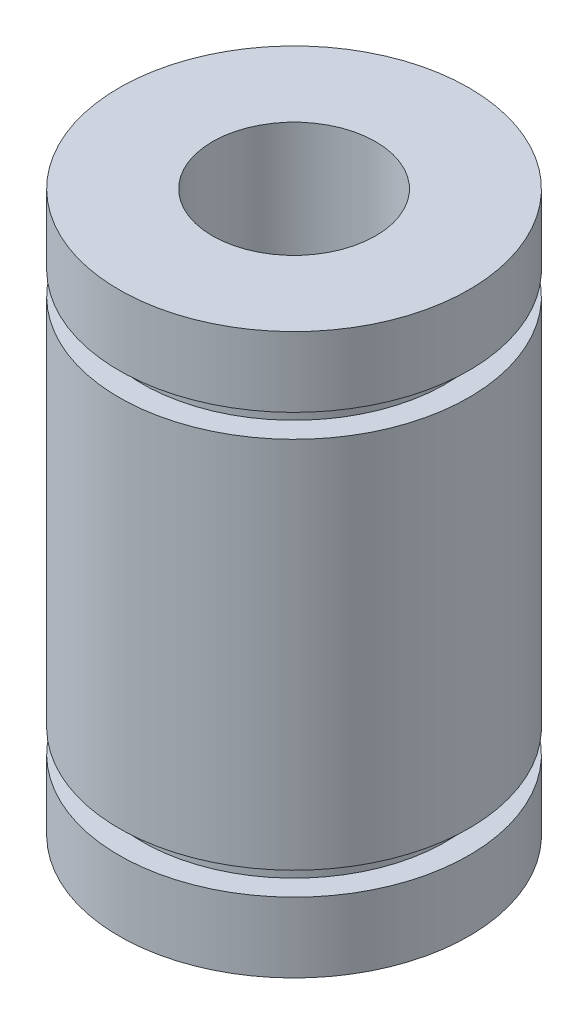
ISO-10303-21;
HEADER;
FILE_DESCRIPTION(('STEP AP214'),'2;1');
FILE_NAME('part.step','',(''),(''),'','','');
FILE_SCHEMA(('AUTOMOTIVE_DESIGN { 1 0 10303 214 1 1 1 1 }'));
ENDSEC;
DATA;
#1=APPLICATION_CONTEXT('core data for automotive mechanical design processes');
#2=APPLICATION_PROTOCOL_DEFINITION('international standard','automotive_design',2000,#1);
#3=PRODUCT_CONTEXT('',#1,'mechanical');
#4=PRODUCT('Part','Part','',(#3));
#5=PRODUCT_RELATED_PRODUCT_CATEGORY('part','',(#4));
#6=PRODUCT_DEFINITION_FORMATION('','',#4);
#7=PRODUCT_DEFINITION_CONTEXT('part definition',#1,'design');
#8=PRODUCT_DEFINITION('design','',#6,#7);
#9=PRODUCT_DEFINITION_SHAPE('','',#8);
#10=(LENGTH_UNIT() NAMED_UNIT(*) SI_UNIT(.MILLI.,.METRE.));
#11=(NAMED_UNIT(*) PLANE_ANGLE_UNIT() SI_UNIT($,.RADIAN.));
#12=(NAMED_UNIT(*) SI_UNIT($,.STERADIAN.) SOLID_ANGLE_UNIT());
#13=UNCERTAINTY_MEASURE_WITH_UNIT(LENGTH_MEASURE(1.E-05),#10,'distance_accuracy_value','');
#14=(GEOMETRIC_REPRESENTATION_CONTEXT(3) GLOBAL_UNCERTAINTY_ASSIGNED_CONTEXT((#13)) GLOBAL_UNIT_ASSIGNED_CONTEXT((#10,
#11,#12)) REPRESENTATION_CONTEXT('',''));
#15=CARTESIAN_POINT('',(0.,0.,0.));
#16=DIRECTION('',(0.,0.,1.));
#17=DIRECTION('',(1.,0.,0.));
#18=AXIS2_PLACEMENT_3D('',#15,#16,#17);
#19=CARTESIAN_POINT('',(-3.5,24.,0.));
#20=DIRECTION('',(0.,-1.,0.));
#21=DIRECTION('',(0.,0.,-1.));
#22=AXIS2_PLACEMENT_3D('',#19,#20,#21);
#23=PLANE('',#22);
#24=CARTESIAN_POINT('',(0.,24.,0.));
#25=DIRECTION('',(0.,-1.,0.));
#26=DIRECTION('',(0.,0.,-1.));
#27=AXIS2_PLACEMENT_3D('',#24,#25,#26);
#28=CIRCLE('',#27,7.5);
#29=CARTESIAN_POINT('',(0.,24.,-7.5));
#30=VERTEX_POINT('',#29);
#31=EDGE_CURVE('E10',#30,#30,#28,.T.);
#32=ORIENTED_EDGE('',*,*,#31,.F.);
#33=EDGE_LOOP('',(#32));
#34=FACE_BOUND('',#33,.T.);
#35=CARTESIAN_POINT('',(0.,24.,0.));
#36=DIRECTION('',(0.,-1.,0.));
#37=DIRECTION('',(0.,0.,-1.));
#38=AXIS2_PLACEMENT_3D('',#35,#36,#37);
#39=CIRCLE('',#38,3.5);
#40=CARTESIAN_POINT('',(0.,24.,-3.5));
#41=VERTEX_POINT('',#40);
#42=EDGE_CURVE('E69',#41,#41,#39,.T.);
#43=ORIENTED_EDGE('',*,*,#42,.T.);
#44=EDGE_LOOP('',(#43));
#45=FACE_BOUND('',#44,.T.);
#46=ADVANCED_FACE('F29',(#34,#45),#23,.F.);
#47=CARTESIAN_POINT('',(0.,0.,0.));
#48=DIRECTION('',(0.,-1.,0.));
#49=DIRECTION('',(0.,0.,-1.));
#50=AXIS2_PLACEMENT_3D('',#47,#48,#49);
#51=CYLINDRICAL_SURFACE('',#50,7.5);
#52=CARTESIAN_POINT('',(0.,21.,0.));
#53=DIRECTION('',(0.,-1.,0.));
#54=DIRECTION('',(0.,0.,-1.));
#55=AXIS2_PLACEMENT_3D('',#52,#53,#54);
#56=CIRCLE('',#55,7.5);
#57=CARTESIAN_POINT('',(0.,21.,-7.5));
#58=VERTEX_POINT('',#57);
#59=EDGE_CURVE('E35',#58,#58,#56,.T.);
#60=ORIENTED_EDGE('',*,*,#59,.F.);
#61=EDGE_LOOP('',(#60));
#62=FACE_BOUND('',#61,.T.);
#63=ORIENTED_EDGE('',*,*,#31,.T.);
#64=EDGE_LOOP('',(#63));
#65=FACE_BOUND('',#64,.T.);
#66=ADVANCED_FACE('F130',(#62,#65),#51,.T.);
#67=CARTESIAN_POINT('',(-7.5,21.,0.));
#68=DIRECTION('',(0.,1.,0.));
#69=DIRECTION('',(0.,0.,1.));
#70=AXIS2_PLACEMENT_3D('',#67,#68,#69);
#71=PLANE('',#70);
#72=CARTESIAN_POINT('',(0.,21.,0.));
#73=DIRECTION('',(0.,-1.,0.));
#74=DIRECTION('',(0.,0.,-1.));
#75=AXIS2_PLACEMENT_3D('',#72,#73,#74);
#76=CIRCLE('',#75,6.5);
#77=CARTESIAN_POINT('',(0.,21.,-6.5));
#78=VERTEX_POINT('',#77);
#79=EDGE_CURVE('E39',#78,#78,#76,.T.);
#80=ORIENTED_EDGE('',*,*,#79,.F.);
#81=EDGE_LOOP('',(#80));
#82=FACE_BOUND('',#81,.T.);
#83=ORIENTED_EDGE('',*,*,#59,.T.);
#84=EDGE_LOOP('',(#83));
#85=FACE_BOUND('',#84,.T.);
#86=ADVANCED_FACE('F125',(#82,#85),#71,.F.);
#87=CARTESIAN_POINT('',(0.,0.,0.));
#88=DIRECTION('',(0.,-1.,0.));
#89=DIRECTION('',(0.,0.,-1.));
#90=AXIS2_PLACEMENT_3D('',#87,#88,#89);
#91=CYLINDRICAL_SURFACE('',#90,6.5);
#92=CARTESIAN_POINT('',(0.,20.,0.));
#93=DIRECTION('',(0.,-1.,0.));
#94=DIRECTION('',(0.,0.,-1.));
#95=AXIS2_PLACEMENT_3D('',#92,#93,#94);
#96=CIRCLE('',#95,6.5);
#97=CARTESIAN_POINT('',(0.,20.,-6.5));
#98=VERTEX_POINT('',#97);
#99=EDGE_CURVE('E43',#98,#98,#96,.T.);
#100=ORIENTED_EDGE('',*,*,#99,.F.);
#101=EDGE_LOOP('',(#100));
#102=FACE_BOUND('',#101,.T.);
#103=ORIENTED_EDGE('',*,*,#79,.T.);
#104=EDGE_LOOP('',(#103));
#105=FACE_BOUND('',#104,.T.);
#106=ADVANCED_FACE('F119',(#102,#105),#91,.T.);
#107=CARTESIAN_POINT('',(-6.5,20.,0.));
#108=DIRECTION('',(0.,-1.,0.));
#109=DIRECTION('',(0.,0.,-1.));
#110=AXIS2_PLACEMENT_3D('',#107,#108,#109);
#111=PLANE('',#110);
#112=CARTESIAN_POINT('',(0.,20.,0.));
#113=DIRECTION('',(0.,-1.,0.));
#114=DIRECTION('',(0.,0.,-1.));
#115=AXIS2_PLACEMENT_3D('',#112,#113,#114);
#116=CIRCLE('',#115,7.5);
#117=CARTESIAN_POINT('',(0.,20.,-7.5));
#118=VERTEX_POINT('',#117);
#119=EDGE_CURVE('E48',#118,#118,#116,.T.);
#120=ORIENTED_EDGE('',*,*,#119,.F.);
#121=EDGE_LOOP('',(#120));
#122=FACE_BOUND('',#121,.T.);
#123=ORIENTED_EDGE('',*,*,#99,.T.);
#124=EDGE_LOOP('',(#123));
#125=FACE_BOUND('',#124,.T.);
#126=ADVANCED_FACE('F113',(#122,#125),#111,.F.);
#127=CARTESIAN_POINT('',(0.,0.,0.));
#128=DIRECTION('',(0.,-1.,0.));
#129=DIRECTION('',(0.,0.,-1.));
#130=AXIS2_PLACEMENT_3D('',#127,#128,#129);
#131=CYLINDRICAL_SURFACE('',#130,7.5);
#132=CARTESIAN_POINT('',(0.,4.,0.));
#133=DIRECTION('',(0.,-1.,0.));
#134=DIRECTION('',(0.,0.,-1.));
#135=AXIS2_PLACEMENT_3D('',#132,#133,#134);
#136=CIRCLE('',#135,7.5);
#137=CARTESIAN_POINT('',(0.,4.,-7.5));
#138=VERTEX_POINT('',#137);
#139=EDGE_CURVE('E51',#138,#138,#136,.T.);
#140=ORIENTED_EDGE('',*,*,#139,.F.);
#141=EDGE_LOOP('',(#140));
#142=FACE_BOUND('',#141,.T.);
#143=ORIENTED_EDGE('',*,*,#119,.T.);
#144=EDGE_LOOP('',(#143));
#145=FACE_BOUND('',#144,.T.);
#146=ADVANCED_FACE('F107',(#142,#145),#131,.T.);
#147=CARTESIAN_POINT('',(-7.5,4.,0.));
#148=DIRECTION('',(0.,1.,0.));
#149=DIRECTION('',(0.,0.,1.));
#150=AXIS2_PLACEMENT_3D('',#147,#148,#149);
#151=PLANE('',#150);
#152=CARTESIAN_POINT('',(0.,4.,0.));
#153=DIRECTION('',(0.,-1.,0.));
#154=DIRECTION('',(0.,0.,-1.));
#155=AXIS2_PLACEMENT_3D('',#152,#153,#154);
#156=CIRCLE('',#155,6.5);
#157=CARTESIAN_POINT('',(0.,4.,-6.5));
#158=VERTEX_POINT('',#157);
#159=EDGE_CURVE('E54',#158,#158,#156,.T.);
#160=ORIENTED_EDGE('',*,*,#159,.F.);
#161=EDGE_LOOP('',(#160));
#162=FACE_BOUND('',#161,.T.);
#163=ORIENTED_EDGE('',*,*,#139,.T.);
#164=EDGE_LOOP('',(#163));
#165=FACE_BOUND('',#164,.T.);
#166=ADVANCED_FACE('F101',(#162,#165),#151,.F.);
#167=CARTESIAN_POINT('',(0.,0.,0.));
#168=DIRECTION('',(0.,-1.,0.));
#169=DIRECTION('',(0.,0.,-1.));
#170=AXIS2_PLACEMENT_3D('',#167,#168,#169);
#171=CYLINDRICAL_SURFACE('',#170,6.5);
#172=CARTESIAN_POINT('',(0.,3.,0.));
#173=DIRECTION('',(0.,-1.,0.));
#174=DIRECTION('',(0.,0.,-1.));
#175=AXIS2_PLACEMENT_3D('',#172,#173,#174);
#176=CIRCLE('',#175,6.5);
#177=CARTESIAN_POINT('',(0.,3.,-6.5));
#178=VERTEX_POINT('',#177);
#179=EDGE_CURVE('E57',#178,#178,#176,.T.);
#180=ORIENTED_EDGE('',*,*,#179,.F.);
#181=EDGE_LOOP('',(#180));
#182=FACE_BOUND('',#181,.T.);
#183=ORIENTED_EDGE('',*,*,#159,.T.);
#184=EDGE_LOOP('',(#183));
#185=FACE_BOUND('',#184,.T.);
#186=ADVANCED_FACE('F95',(#182,#185),#171,.T.);
#187=CARTESIAN_POINT('',(-6.5,3.,0.));
#188=DIRECTION('',(0.,-1.,0.));
#189=DIRECTION('',(0.,0.,-1.));
#190=AXIS2_PLACEMENT_3D('',#187,#188,#189);
#191=PLANE('',#190);
#192=CARTESIAN_POINT('',(0.,3.,0.));
#193=DIRECTION('',(0.,-1.,0.));
#194=DIRECTION('',(0.,0.,-1.));
#195=AXIS2_PLACEMENT_3D('',#192,#193,#194);
#196=CIRCLE('',#195,7.5);
#197=CARTESIAN_POINT('',(0.,3.,-7.5));
#198=VERTEX_POINT('',#197);
#199=EDGE_CURVE('E60',#198,#198,#196,.T.);
#200=ORIENTED_EDGE('',*,*,#199,.F.);
#201=EDGE_LOOP('',(#200));
#202=FACE_BOUND('',#201,.T.);
#203=ORIENTED_EDGE('',*,*,#179,.T.);
#204=EDGE_LOOP('',(#203));
#205=FACE_BOUND('',#204,.T.);
#206=ADVANCED_FACE('F89',(#202,#205),#191,.F.);
#207=CARTESIAN_POINT('',(0.,0.,0.));
#208=DIRECTION('',(0.,-1.,0.));
#209=DIRECTION('',(0.,0.,-1.));
#210=AXIS2_PLACEMENT_3D('',#207,#208,#209);
#211=CYLINDRICAL_SURFACE('',#210,7.5);
#212=CARTESIAN_POINT('',(0.,0.,0.));
#213=DIRECTION('',(0.,-1.,0.));
#214=DIRECTION('',(0.,0.,-1.));
#215=AXIS2_PLACEMENT_3D('',#212,#213,#214);
#216=CIRCLE('',#215,7.5);
#217=CARTESIAN_POINT('',(0.,0.,-7.5));
#218=VERTEX_POINT('',#217);
#219=EDGE_CURVE('E63',#218,#218,#216,.T.);
#220=ORIENTED_EDGE('',*,*,#219,.F.);
#221=EDGE_LOOP('',(#220));
#222=FACE_BOUND('',#221,.T.);
#223=ORIENTED_EDGE('',*,*,#199,.T.);
#224=EDGE_LOOP('',(#223));
#225=FACE_BOUND('',#224,.T.);
#226=ADVANCED_FACE('F83',(#222,#225),#211,.T.);
#227=CARTESIAN_POINT('',(-7.5,0.,0.));
#228=DIRECTION('',(0.,1.,0.));
#229=DIRECTION('',(0.,0.,1.));
#230=AXIS2_PLACEMENT_3D('',#227,#228,#229);
#231=PLANE('',#230);
#232=CARTESIAN_POINT('',(0.,0.,0.));
#233=DIRECTION('',(0.,-1.,0.));
#234=DIRECTION('',(0.,0.,-1.));
#235=AXIS2_PLACEMENT_3D('',#232,#233,#234);
#236=CIRCLE('',#235,3.5);
#237=CARTESIAN_POINT('',(0.,0.,-3.5));
#238=VERTEX_POINT('',#237);
#239=EDGE_CURVE('E66',#238,#238,#236,.T.);
#240=ORIENTED_EDGE('',*,*,#239,.F.);
#241=EDGE_LOOP('',(#240));
#242=FACE_BOUND('',#241,.T.);
#243=ORIENTED_EDGE('',*,*,#219,.T.);
#244=EDGE_LOOP('',(#243));
#245=FACE_BOUND('',#244,.T.);
#246=ADVANCED_FACE('F77',(#242,#245),#231,.F.);
#247=CARTESIAN_POINT('',(0.,0.,0.));
#248=DIRECTION('',(0.,-1.,0.));
#249=DIRECTION('',(0.,0.,-1.));
#250=AXIS2_PLACEMENT_3D('',#247,#248,#249);
#251=CYLINDRICAL_SURFACE('',#250,3.5);
#252=ORIENTED_EDGE('',*,*,#42,.F.);
#253=EDGE_LOOP('',(#252));
#254=FACE_BOUND('',#253,.T.);
#255=ORIENTED_EDGE('',*,*,#239,.T.);
#256=EDGE_LOOP('',(#255));
#257=FACE_BOUND('',#256,.T.);
#258=ADVANCED_FACE('F74',(#254,#257),#251,.F.);
#259=CLOSED_SHELL('',(#46,#66,#86,#106,#126,#146,#166,#186,#206,#226,#246,#258));
#260=MANIFOLD_SOLID_BREP('B2',#259);
#261=ADVANCED_BREP_SHAPE_REPRESENTATION('',(#18,#260),#14);
#262=SHAPE_DEFINITION_REPRESENTATION(#9,#261);
ENDSEC;
END-ISO-10303-21;
